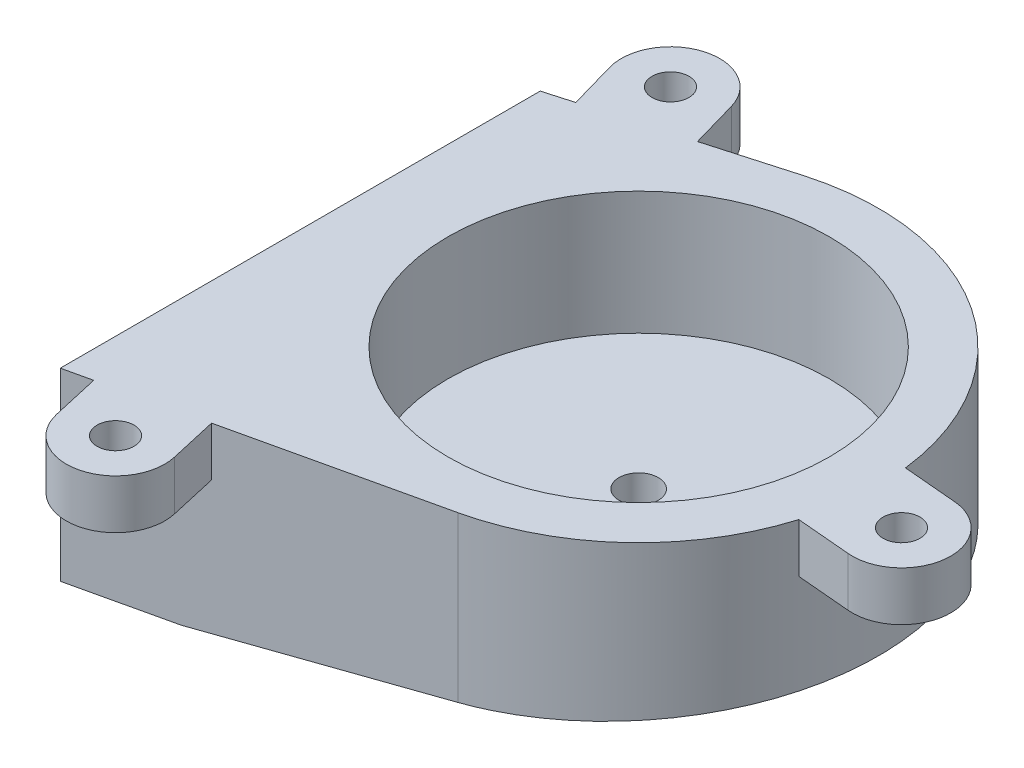
ISO-10303-21;
HEADER;
FILE_DESCRIPTION(('STEP AP214'),'2;1');
FILE_NAME('part.step','',(''),(''),'','','');
FILE_SCHEMA(('AUTOMOTIVE_DESIGN { 1 0 10303 214 1 1 1 1 }'));
ENDSEC;
DATA;
#1=APPLICATION_CONTEXT('core data for automotive mechanical design processes');
#2=APPLICATION_PROTOCOL_DEFINITION('international standard','automotive_design',2000,#1);
#3=PRODUCT_CONTEXT('',#1,'mechanical');
#4=PRODUCT('Part','Part','',(#3));
#5=PRODUCT_RELATED_PRODUCT_CATEGORY('part','',(#4));
#6=PRODUCT_DEFINITION_FORMATION('','',#4);
#7=PRODUCT_DEFINITION_CONTEXT('part definition',#1,'design');
#8=PRODUCT_DEFINITION('design','',#6,#7);
#9=PRODUCT_DEFINITION_SHAPE('','',#8);
#10=(LENGTH_UNIT() NAMED_UNIT(*) SI_UNIT(.MILLI.,.METRE.));
#11=(NAMED_UNIT(*) PLANE_ANGLE_UNIT() SI_UNIT($,.RADIAN.));
#12=(NAMED_UNIT(*) SI_UNIT($,.STERADIAN.) SOLID_ANGLE_UNIT());
#13=UNCERTAINTY_MEASURE_WITH_UNIT(LENGTH_MEASURE(1.E-05),#10,'distance_accuracy_value','');
#14=(GEOMETRIC_REPRESENTATION_CONTEXT(3) GLOBAL_UNCERTAINTY_ASSIGNED_CONTEXT((#13)) GLOBAL_UNIT_ASSIGNED_CONTEXT((#10,
#11,#12)) REPRESENTATION_CONTEXT('',''));
#15=CARTESIAN_POINT('',(0.,0.,0.));
#16=DIRECTION('',(0.,0.,1.));
#17=DIRECTION('',(1.,0.,0.));
#18=AXIS2_PLACEMENT_3D('',#15,#16,#17);
#19=CARTESIAN_POINT('',(4.32348319389158,15.,19.0146652106246));
#20=DIRECTION('',(0.221717086866235,0.,0.975111036442287));
#21=DIRECTION('',(0.975111036442287,0.,-0.221717086866235));
#22=AXIS2_PLACEMENT_3D('',#19,#20,#21);
#23=PLANE('',#22);
#24=DIRECTION('',(0.975111036442287,0.,-0.221717086866235));
#25=VECTOR('',#24,1.);
#26=CARTESIAN_POINT('',(4.32348319389158,11.,19.0146652106246));
#27=LINE('',#26,#25);
#28=CARTESIAN_POINT('',(-19.7873124932341,11.,24.4968874212158));
#29=VERTEX_POINT('',#28);
#30=CARTESIAN_POINT('',(-11.9864242016958,11.,22.7231507262859));
#31=VERTEX_POINT('',#30);
#32=EDGE_CURVE('E210',#29,#31,#27,.T.);
#33=ORIENTED_EDGE('',*,*,#32,.F.);
#34=DIRECTION('',(0.,1.,0.));
#35=VECTOR('',#34,1.);
#36=CARTESIAN_POINT('',(-19.7873124932341,11.,24.4968874212158));
#37=LINE('',#36,#35);
#38=CARTESIAN_POINT('',(-19.7873124932341,15.,24.4968874212158));
#39=VERTEX_POINT('',#38);
#40=EDGE_CURVE('E224',#29,#39,#37,.T.);
#41=ORIENTED_EDGE('',*,*,#40,.T.);
#42=DIRECTION('',(-0.975111036442287,0.,0.221717086866235));
#43=VECTOR('',#42,1.);
#44=CARTESIAN_POINT('',(4.32348319389158,15.,19.0146652106246));
#45=LINE('',#44,#43);
#46=CARTESIAN_POINT('',(-22.,15.,25.));
#47=VERTEX_POINT('',#46);
#48=EDGE_CURVE('E308',#39,#47,#45,.T.);
#49=ORIENTED_EDGE('',*,*,#48,.T.);
#50=DIRECTION('',(0.,-1.,0.));
#51=VECTOR('',#50,1.);
#52=CARTESIAN_POINT('',(-22.,15.,25.));
#53=LINE('',#52,#51);
#54=CARTESIAN_POINT('',(-22.,0.,25.));
#55=VERTEX_POINT('',#54);
#56=EDGE_CURVE('E323',#47,#55,#53,.T.);
#57=ORIENTED_EDGE('',*,*,#56,.T.);
#58=DIRECTION('',(-0.975111036442287,0.,0.221717086866235));
#59=VECTOR('',#58,1.);
#60=CARTESIAN_POINT('',(4.32348319389158,0.,19.0146652106246));
#61=LINE('',#60,#59);
#62=CARTESIAN_POINT('',(-14.,0.,23.1809900322722));
#63=VERTEX_POINT('',#62);
#64=EDGE_CURVE('E317',#63,#55,#61,.T.);
#65=ORIENTED_EDGE('',*,*,#64,.F.);
#66=DIRECTION('',(0.971414372160437,0.0869923318352629,-0.220876553219231));
#67=VECTOR('',#66,1.);
#68=CARTESIAN_POINT('',(5.4524012180103,1.7420060792248,18.7579760682972));
#69=LINE('',#68,#67);
#70=CARTESIAN_POINT('',(4.32348319389158,1.64090894273656,19.0146652106246));
#71=VERTEX_POINT('',#70);
#72=EDGE_CURVE('E291',#63,#71,#69,.T.);
#73=ORIENTED_EDGE('',*,*,#72,.T.);
#74=DIRECTION('',(0.,-1.,0.));
#75=VECTOR('',#74,1.);
#76=CARTESIAN_POINT('',(4.32348319389158,15.,19.0146652106246));
#77=LINE('',#76,#75);
#78=CARTESIAN_POINT('',(4.32348319389158,15.,19.0146652106246));
#79=VERTEX_POINT('',#78);
#80=EDGE_CURVE('E326',#79,#71,#77,.T.);
#81=ORIENTED_EDGE('',*,*,#80,.F.);
#82=CARTESIAN_POINT('',(-11.9864242016958,15.,22.7231507262859));
#83=VERTEX_POINT('',#82);
#84=EDGE_CURVE('E309',#79,#83,#45,.T.);
#85=ORIENTED_EDGE('',*,*,#84,.T.);
#86=DIRECTION('',(0.,1.,0.));
#87=VECTOR('',#86,1.);
#88=CARTESIAN_POINT('',(-11.9864242016958,11.,22.7231507262859));
#89=LINE('',#88,#87);
#90=EDGE_CURVE('E228',#31,#83,#89,.T.);
#91=ORIENTED_EDGE('',*,*,#90,.F.);
#92=EDGE_LOOP('',(#33,#41,#49,#57,#65,#73,#81,#85,#91));
#93=FACE_BOUND('',#92,.T.);
#94=ADVANCED_FACE('F37',(#93),#23,.T.);
#95=CARTESIAN_POINT('',(-5.35142928494359,15.,-18.7513254093743));
#96=DIRECTION('',(-0.274432271022749,0.,-0.961606431249967));
#97=DIRECTION('',(-0.961606431249967,0.,0.274432271022749));
#98=AXIS2_PLACEMENT_3D('',#95,#96,#97);
#99=PLANE('',#98);
#100=DIRECTION('',(-0.961606431249967,0.,0.274432271022748));
#101=VECTOR('',#100,1.);
#102=CARTESIAN_POINT('',(-5.35142928494359,11.,-18.7513254093743));
#103=LINE('',#102,#101);
#104=CARTESIAN_POINT('',(-12.0558451909091,11.,-16.8379562562963));
#105=VERTEX_POINT('',#104);
#106=CARTESIAN_POINT('',(-19.7486966409089,11.,-14.6424980881143));
#107=VERTEX_POINT('',#106);
#108=EDGE_CURVE('E247',#105,#107,#103,.T.);
#109=ORIENTED_EDGE('',*,*,#108,.F.);
#110=DIRECTION('',(0.,1.,0.));
#111=VECTOR('',#110,1.);
#112=CARTESIAN_POINT('',(-12.0558451909091,11.,-16.8379562562963));
#113=LINE('',#112,#111);
#114=CARTESIAN_POINT('',(-12.0558451909091,15.,-16.8379562562963));
#115=VERTEX_POINT('',#114);
#116=EDGE_CURVE('E261',#105,#115,#113,.T.);
#117=ORIENTED_EDGE('',*,*,#116,.T.);
#118=DIRECTION('',(0.961606431249967,0.,-0.274432271022748));
#119=VECTOR('',#118,1.);
#120=CARTESIAN_POINT('',(-5.35142928494359,15.,-18.7513254093743));
#121=LINE('',#120,#119);
#122=CARTESIAN_POINT('',(-5.3514292849436,15.,-18.7513254093743));
#123=VERTEX_POINT('',#122);
#124=EDGE_CURVE('E301',#115,#123,#121,.T.);
#125=ORIENTED_EDGE('',*,*,#124,.T.);
#126=DIRECTION('',(0.,-1.,0.));
#127=VECTOR('',#126,1.);
#128=CARTESIAN_POINT('',(-5.3514292849436,15.,-18.7513254093743));
#129=LINE('',#128,#127);
#130=CARTESIAN_POINT('',(-5.3514292849436,0.774498870005051,-18.7513254093743));
#131=VERTEX_POINT('',#130);
#132=EDGE_CURVE('E314',#123,#131,#129,.T.);
#133=ORIENTED_EDGE('',*,*,#132,.T.);
#134=DIRECTION('',(-0.958060684401584,-0.0857964792001418,0.273420352499275));
#135=VECTOR('',#134,1.);
#136=CARTESIAN_POINT('',(-4.18211822024305,0.879213293709578,-19.0850343786464));
#137=LINE('',#136,#135);
#138=CARTESIAN_POINT('',(-14.,0.,-16.2831151049272));
#139=VERTEX_POINT('',#138);
#140=EDGE_CURVE('E294',#131,#139,#137,.T.);
#141=ORIENTED_EDGE('',*,*,#140,.T.);
#142=DIRECTION('',(0.961606431249967,0.,-0.274432271022748));
#143=VECTOR('',#142,1.);
#144=CARTESIAN_POINT('',(-5.35142928494359,0.,-18.7513254093743));
#145=LINE('',#144,#143);
#146=CARTESIAN_POINT('',(-22.,0.,-14.));
#147=VERTEX_POINT('',#146);
#148=EDGE_CURVE('E297',#147,#139,#145,.T.);
#149=ORIENTED_EDGE('',*,*,#148,.F.);
#150=DIRECTION('',(0.,-1.,0.));
#151=VECTOR('',#150,1.);
#152=CARTESIAN_POINT('',(-22.,15.,-14.));
#153=LINE('',#152,#151);
#154=CARTESIAN_POINT('',(-22.,15.,-14.));
#155=VERTEX_POINT('',#154);
#156=EDGE_CURVE('E321',#155,#147,#153,.T.);
#157=ORIENTED_EDGE('',*,*,#156,.F.);
#158=CARTESIAN_POINT('',(-19.7486966409089,15.,-14.6424980881143));
#159=VERTEX_POINT('',#158);
#160=EDGE_CURVE('E303',#155,#159,#121,.T.);
#161=ORIENTED_EDGE('',*,*,#160,.T.);
#162=DIRECTION('',(0.,1.,0.));
#163=VECTOR('',#162,1.);
#164=CARTESIAN_POINT('',(-19.7486966409089,11.,-14.6424980881143));
#165=LINE('',#164,#163);
#166=EDGE_CURVE('E265',#107,#159,#165,.T.);
#167=ORIENTED_EDGE('',*,*,#166,.F.);
#168=EDGE_LOOP('',(#109,#117,#125,#133,#141,#149,#157,#161,#167));
#169=FACE_BOUND('',#168,.T.);
#170=ADVANCED_FACE('F370',(#169),#99,.T.);
#171=CARTESIAN_POINT('',(0.,15.,0.));
#172=DIRECTION('',(0.,-1.,0.));
#173=DIRECTION('',(0.,0.,-1.));
#174=AXIS2_PLACEMENT_3D('',#171,#172,#173);
#175=CYLINDRICAL_SURFACE('',#174,19.5);
#176=DIRECTION('',(0.,1.,0.));
#177=VECTOR('',#176,1.);
#178=CARTESIAN_POINT('',(18.664086252509,11.,5.64817531233798));
#179=LINE('',#178,#177);
#180=CARTESIAN_POINT('',(18.664086252509,11.,5.64817531233798));
#181=VERTEX_POINT('',#180);
#182=CARTESIAN_POINT('',(18.664086252509,15.,5.64817531233798));
#183=VERTEX_POINT('',#182);
#184=EDGE_CURVE('E177',#181,#183,#179,.T.);
#185=ORIENTED_EDGE('',*,*,#184,.T.);
#186=CARTESIAN_POINT('',(0.,15.,0.));
#187=DIRECTION('',(0.,-1.,0.));
#188=DIRECTION('',(0.,0.,-1.));
#189=AXIS2_PLACEMENT_3D('',#186,#187,#188);
#190=CIRCLE('',#189,19.5);
#191=EDGE_CURVE('E305',#183,#79,#190,.T.);
#192=ORIENTED_EDGE('',*,*,#191,.T.);
#193=ORIENTED_EDGE('',*,*,#80,.T.);
#194=CARTESIAN_POINT('',(0.,1.25373134328358,0.));
#195=DIRECTION('',(0.0891952975496599,-0.996014155971203,0.));
#196=DIRECTION('',(-0.996014155971203,-0.0891952975496599,0.));
#197=AXIS2_PLACEMENT_3D('',#194,#195,#196);
#198=ELLIPSE('',#197,19.5780349938759,19.5);
#199=EDGE_CURVE('E288',#71,#131,#198,.F.);
#200=ORIENTED_EDGE('',*,*,#199,.T.);
#201=ORIENTED_EDGE('',*,*,#132,.F.);
#202=CARTESIAN_POINT('',(19.3613321944903,15.,-2.32138227239599));
#203=VERTEX_POINT('',#202);
#204=EDGE_CURVE('E306',#123,#203,#190,.T.);
#205=ORIENTED_EDGE('',*,*,#204,.T.);
#206=DIRECTION('',(0.,1.,0.));
#207=VECTOR('',#206,1.);
#208=CARTESIAN_POINT('',(19.3613321944903,11.,-2.32138227239599));
#209=LINE('',#208,#207);
#210=CARTESIAN_POINT('',(19.3613321944903,11.,-2.32138227239599));
#211=VERTEX_POINT('',#210);
#212=EDGE_CURVE('E57',#211,#203,#209,.T.);
#213=ORIENTED_EDGE('',*,*,#212,.F.);
#214=CARTESIAN_POINT('',(0.,11.,0.));
#215=DIRECTION('',(0.,1.,0.));
#216=DIRECTION('',(0.,0.,1.));
#217=AXIS2_PLACEMENT_3D('',#214,#215,#216);
#218=CIRCLE('',#217,19.5);
#219=EDGE_CURVE('E52',#181,#211,#218,.T.);
#220=ORIENTED_EDGE('',*,*,#219,.F.);
#221=EDGE_LOOP('',(#185,#192,#193,#200,#201,#205,#213,#220));
#222=FACE_BOUND('',#221,.T.);
#223=ADVANCED_FACE('F376',(#222),#175,.T.);
#224=CARTESIAN_POINT('',(0.,0.,0.));
#225=DIRECTION('',(0.,1.,0.));
#226=DIRECTION('',(0.,0.,1.));
#227=AXIS2_PLACEMENT_3D('',#224,#225,#226);
#228=PLANE('',#227);
#229=CARTESIAN_POINT('',(-18.,0.,5.5));
#230=DIRECTION('',(0.,-1.,0.));
#231=DIRECTION('',(0.,0.,-1.));
#232=AXIS2_PLACEMENT_3D('',#229,#230,#231);
#233=CIRCLE('',#232,2.05);
#234=CARTESIAN_POINT('',(-18.,0.,3.45));
#235=VERTEX_POINT('',#234);
#236=EDGE_CURVE('E277',#235,#235,#233,.T.);
#237=ORIENTED_EDGE('',*,*,#236,.F.);
#238=EDGE_LOOP('',(#237));
#239=FACE_BOUND('',#238,.T.);
#240=DIRECTION('',(0.,0.,-1.));
#241=VECTOR('',#240,1.);
#242=CARTESIAN_POINT('',(-14.,0.,0.));
#243=LINE('',#242,#241);
#244=EDGE_CURVE('E11',#63,#139,#243,.T.);
#245=ORIENTED_EDGE('',*,*,#244,.F.);
#246=ORIENTED_EDGE('',*,*,#64,.T.);
#247=DIRECTION('',(0.,0.,-1.));
#248=VECTOR('',#247,1.);
#249=CARTESIAN_POINT('',(-22.,0.,0.));
#250=LINE('',#249,#248);
#251=EDGE_CURVE('E302',#55,#147,#250,.T.);
#252=ORIENTED_EDGE('',*,*,#251,.T.);
#253=ORIENTED_EDGE('',*,*,#148,.T.);
#254=EDGE_LOOP('',(#245,#246,#252,#253));
#255=FACE_BOUND('',#254,.T.);
#256=ADVANCED_FACE('F39',(#239,#255),#228,.F.);
#257=CARTESIAN_POINT('',(0.,5.,0.));
#258=DIRECTION('',(0.,1.,0.));
#259=DIRECTION('',(0.,0.,1.));
#260=AXIS2_PLACEMENT_3D('',#257,#258,#259);
#261=PLANE('',#260);
#262=CARTESIAN_POINT('',(0.,5.,0.));
#263=DIRECTION('',(0.,1.,0.));
#264=DIRECTION('',(0.,0.,1.));
#265=AXIS2_PLACEMENT_3D('',#262,#263,#264);
#266=CIRCLE('',#265,1.6);
#267=CARTESIAN_POINT('',(0.,5.,1.6));
#268=VERTEX_POINT('',#267);
#269=EDGE_CURVE('E283',#268,#268,#266,.T.);
#270=ORIENTED_EDGE('',*,*,#269,.F.);
#271=EDGE_LOOP('',(#270));
#272=FACE_BOUND('',#271,.T.);
#273=CARTESIAN_POINT('',(0.,5.,0.));
#274=DIRECTION('',(0.,1.,0.));
#275=DIRECTION('',(0.,0.,1.));
#276=AXIS2_PLACEMENT_3D('',#273,#274,#275);
#277=CIRCLE('',#276,15.5);
#278=CARTESIAN_POINT('',(0.,5.,15.5));
#279=VERTEX_POINT('',#278);
#280=EDGE_CURVE('E45',#279,#279,#277,.T.);
#281=ORIENTED_EDGE('',*,*,#280,.T.);
#282=EDGE_LOOP('',(#281));
#283=FACE_BOUND('',#282,.T.);
#284=ADVANCED_FACE('F333',(#272,#283),#261,.T.);
#285=CARTESIAN_POINT('',(-22.,15.,0.));
#286=DIRECTION('',(-1.,0.,0.));
#287=DIRECTION('',(0.,0.,1.));
#288=AXIS2_PLACEMENT_3D('',#285,#286,#287);
#289=PLANE('',#288);
#290=ORIENTED_EDGE('',*,*,#251,.F.);
#291=ORIENTED_EDGE('',*,*,#56,.F.);
#292=DIRECTION('',(0.,0.,-1.));
#293=VECTOR('',#292,1.);
#294=CARTESIAN_POINT('',(-22.,15.,0.));
#295=LINE('',#294,#293);
#296=EDGE_CURVE('E311',#47,#155,#295,.T.);
#297=ORIENTED_EDGE('',*,*,#296,.T.);
#298=ORIENTED_EDGE('',*,*,#156,.T.);
#299=EDGE_LOOP('',(#290,#291,#297,#298));
#300=FACE_BOUND('',#299,.T.);
#301=ADVANCED_FACE('F339',(#300),#289,.T.);
#302=CARTESIAN_POINT('',(0.,15.,0.));
#303=DIRECTION('',(0.,-1.,0.));
#304=DIRECTION('',(0.,0.,-1.));
#305=AXIS2_PLACEMENT_3D('',#302,#303,#304);
#306=CYLINDRICAL_SURFACE('',#305,15.5);
#307=ORIENTED_EDGE('',*,*,#280,.F.);
#308=EDGE_LOOP('',(#307));
#309=FACE_BOUND('',#308,.T.);
#310=CARTESIAN_POINT('',(0.,15.,0.));
#311=DIRECTION('',(0.,-1.,0.));
#312=DIRECTION('',(0.,0.,-1.));
#313=AXIS2_PLACEMENT_3D('',#310,#311,#312);
#314=CIRCLE('',#313,15.5);
#315=CARTESIAN_POINT('',(0.,15.,-15.5));
#316=VERTEX_POINT('',#315);
#317=EDGE_CURVE('E298',#316,#316,#314,.T.);
#318=ORIENTED_EDGE('',*,*,#317,.F.);
#319=EDGE_LOOP('',(#318));
#320=FACE_BOUND('',#319,.T.);
#321=ADVANCED_FACE('F335',(#309,#320),#306,.F.);
#322=CARTESIAN_POINT('',(0.,15.,0.));
#323=DIRECTION('',(0.,-1.,0.));
#324=DIRECTION('',(0.,0.,-1.));
#325=AXIS2_PLACEMENT_3D('',#322,#323,#324);
#326=PLANE('',#325);
#327=ORIENTED_EDGE('',*,*,#317,.T.);
#328=EDGE_LOOP('',(#327));
#329=FACE_BOUND('',#328,.T.);
#330=ORIENTED_EDGE('',*,*,#160,.F.);
#331=ORIENTED_EDGE('',*,*,#296,.F.);
#332=ORIENTED_EDGE('',*,*,#48,.F.);
#333=DIRECTION('',(-0.221717086866236,0.,-0.975111036442286));
#334=VECTOR('',#333,1.);
#335=CARTESIAN_POINT('',(-24.1107956871257,15.,5.48222221059121));
#336=LINE('',#335,#334);
#337=CARTESIAN_POINT('',(-18.9004441457691,15.,28.3973315669849));
#338=VERTEX_POINT('',#337);
#339=EDGE_CURVE('E216',#338,#39,#336,.T.);
#340=ORIENTED_EDGE('',*,*,#339,.F.);
#341=CARTESIAN_POINT('',(-15.,15.,27.51046321952));
#342=DIRECTION('',(0.,1.,0.));
#343=DIRECTION('',(0.,0.,1.));
#344=AXIS2_PLACEMENT_3D('',#341,#342,#343);
#345=CIRCLE('',#344,4.);
#346=CARTESIAN_POINT('',(-11.0995558542309,15.,26.623594872055));
#347=VERTEX_POINT('',#346);
#348=EDGE_CURVE('E219',#338,#347,#345,.T.);
#349=ORIENTED_EDGE('',*,*,#348,.T.);
#350=DIRECTION('',(-0.221717086866235,0.,-0.975111036442287));
#351=VECTOR('',#350,1.);
#352=CARTESIAN_POINT('',(-16.3099073955874,15.,3.7084855156613));
#353=LINE('',#352,#351);
#354=EDGE_CURVE('E201',#347,#83,#353,.T.);
#355=ORIENTED_EDGE('',*,*,#354,.T.);
#356=ORIENTED_EDGE('',*,*,#84,.F.);
#357=ORIENTED_EDGE('',*,*,#191,.F.);
#358=DIRECTION('',(0.996194698091746,0.,0.0871557427476584));
#359=VECTOR('',#358,1.);
#360=CARTESIAN_POINT('',(-0.348622970990634,15.,3.98477879236698));
#361=LINE('',#360,#359);
#362=CARTESIAN_POINT('',(23.0619524341654,15.,6.03293874693695));
#363=VERTEX_POINT('',#362);
#364=EDGE_CURVE('E188',#183,#363,#361,.T.);
#365=ORIENTED_EDGE('',*,*,#364,.T.);
#366=CARTESIAN_POINT('',(23.410575405156,15.,2.04815995456997));
#367=DIRECTION('',(0.,1.,0.));
#368=DIRECTION('',(0.,0.,1.));
#369=AXIS2_PLACEMENT_3D('',#366,#367,#368);
#370=CIRCLE('',#369,3.99999999999999);
#371=CARTESIAN_POINT('',(23.7591983761467,15.,-1.93661883779701));
#372=VERTEX_POINT('',#371);
#373=EDGE_CURVE('E159',#363,#372,#370,.T.);
#374=ORIENTED_EDGE('',*,*,#373,.T.);
#375=DIRECTION('',(0.996194698091746,0.,0.0871557427476586));
#376=VECTOR('',#375,1.);
#377=CARTESIAN_POINT('',(0.348622970990635,15.,-3.98477879236699));
#378=LINE('',#377,#376);
#379=EDGE_CURVE('E181',#203,#372,#378,.T.);
#380=ORIENTED_EDGE('',*,*,#379,.F.);
#381=ORIENTED_EDGE('',*,*,#204,.F.);
#382=ORIENTED_EDGE('',*,*,#124,.F.);
#383=DIRECTION('',(0.274432271022749,0.,0.961606431249967));
#384=VECTOR('',#383,1.);
#385=CARTESIAN_POINT('',(-6.70441590596554,15.,1.91336915307806));
#386=LINE('',#385,#384);
#387=CARTESIAN_POINT('',(-13.1535742750001,15.,-20.6843819812962));
#388=VERTEX_POINT('',#387);
#389=EDGE_CURVE('E253',#388,#115,#386,.T.);
#390=ORIENTED_EDGE('',*,*,#389,.F.);
#391=CARTESIAN_POINT('',(-17.,15.,-19.5866528972052));
#392=DIRECTION('',(0.,1.,0.));
#393=DIRECTION('',(0.,0.,1.));
#394=AXIS2_PLACEMENT_3D('',#391,#392,#393);
#395=CIRCLE('',#394,4.);
#396=CARTESIAN_POINT('',(-20.8464257249999,15.,-18.4889238131142));
#397=VERTEX_POINT('',#396);
#398=EDGE_CURVE('E256',#388,#397,#395,.T.);
#399=ORIENTED_EDGE('',*,*,#398,.T.);
#400=DIRECTION('',(0.274432271022748,0.,0.961606431249967));
#401=VECTOR('',#400,1.);
#402=CARTESIAN_POINT('',(-14.3972673559653,15.,4.10882732126004));
#403=LINE('',#402,#401);
#404=EDGE_CURVE('E238',#397,#159,#403,.T.);
#405=ORIENTED_EDGE('',*,*,#404,.T.);
#406=EDGE_LOOP('',(#330,#331,#332,#340,#349,#355,#356,#357,#365,#374,#380,#381,#382,#390,#399,#405));
#407=FACE_BOUND('',#406,.T.);
#408=CARTESIAN_POINT('',(-17.,15.,-19.5866528972052));
#409=DIRECTION('',(0.,1.,0.));
#410=DIRECTION('',(0.,0.,1.));
#411=AXIS2_PLACEMENT_3D('',#408,#409,#410);
#412=CIRCLE('',#411,1.5);
#413=CARTESIAN_POINT('',(-17.,15.,-18.0866528972052));
#414=VERTEX_POINT('',#413);
#415=EDGE_CURVE('E227',#414,#414,#412,.T.);
#416=ORIENTED_EDGE('',*,*,#415,.F.);
#417=EDGE_LOOP('',(#416));
#418=FACE_BOUND('',#417,.T.);
#419=CARTESIAN_POINT('',(-15.,15.,27.51046321952));
#420=DIRECTION('',(0.,1.,0.));
#421=DIRECTION('',(0.,0.,1.));
#422=AXIS2_PLACEMENT_3D('',#419,#420,#421);
#423=CIRCLE('',#422,1.5);
#424=CARTESIAN_POINT('',(-15.,15.,29.01046321952));
#425=VERTEX_POINT('',#424);
#426=EDGE_CURVE('E194',#425,#425,#423,.T.);
#427=ORIENTED_EDGE('',*,*,#426,.F.);
#428=EDGE_LOOP('',(#427));
#429=FACE_BOUND('',#428,.T.);
#430=CARTESIAN_POINT('',(23.410575405156,15.,2.04815995456997));
#431=DIRECTION('',(0.,1.,0.));
#432=DIRECTION('',(0.,0.,1.));
#433=AXIS2_PLACEMENT_3D('',#430,#431,#432);
#434=CIRCLE('',#433,1.5);
#435=CARTESIAN_POINT('',(23.410575405156,15.,3.54815995456997));
#436=VERTEX_POINT('',#435);
#437=EDGE_CURVE('E178',#436,#436,#434,.T.);
#438=ORIENTED_EDGE('',*,*,#437,.F.);
#439=EDGE_LOOP('',(#438));
#440=FACE_BOUND('',#439,.T.);
#441=ADVANCED_FACE('F338',(#329,#407,#418,#429,#440),#326,.F.);
#442=CARTESIAN_POINT('',(-0.111381215469613,1.24375690607735,-23.5866528972052));
#443=DIRECTION('',(0.0891952975496599,-0.996014155971203,0.));
#444=DIRECTION('',(0.996014155971203,0.0891952975496599,0.));
#445=AXIS2_PLACEMENT_3D('',#442,#443,#444);
#446=PLANE('',#445);
#447=CARTESIAN_POINT('',(0.,1.25373134328358,0.));
#448=DIRECTION('',(0.0891952975496599,-0.996014155971203,0.));
#449=DIRECTION('',(0.996014155971203,0.0891952975496599,0.));
#450=AXIS2_PLACEMENT_3D('',#447,#448,#449);
#451=ELLIPSE('',#450,4.01600717823096,4.);
#452=CARTESIAN_POINT('',(4.,1.61194029850746,0.));
#453=VERTEX_POINT('',#452);
#454=EDGE_CURVE('E264',#453,#453,#451,.F.);
#455=ORIENTED_EDGE('',*,*,#454,.T.);
#456=EDGE_LOOP('',(#455));
#457=FACE_BOUND('',#456,.T.);
#458=ORIENTED_EDGE('',*,*,#199,.F.);
#459=ORIENTED_EDGE('',*,*,#72,.F.);
#460=ORIENTED_EDGE('',*,*,#244,.T.);
#461=ORIENTED_EDGE('',*,*,#140,.F.);
#462=EDGE_LOOP('',(#458,#459,#460,#461));
#463=FACE_BOUND('',#462,.T.);
#464=ADVANCED_FACE('F345',(#457,#463),#446,.T.);
#465=CARTESIAN_POINT('',(0.,0.,0.));
#466=DIRECTION('',(0.,1.,0.));
#467=DIRECTION('',(0.,0.,1.));
#468=AXIS2_PLACEMENT_3D('',#465,#466,#467);
#469=CYLINDRICAL_SURFACE('',#468,1.6);
#470=CARTESIAN_POINT('',(0.,2.,0.));
#471=DIRECTION('',(0.,1.,0.));
#472=DIRECTION('',(0.,0.,1.));
#473=AXIS2_PLACEMENT_3D('',#470,#471,#472);
#474=CIRCLE('',#473,1.6);
#475=CARTESIAN_POINT('',(0.,2.,1.6));
#476=VERTEX_POINT('',#475);
#477=EDGE_CURVE('E274',#476,#476,#474,.T.);
#478=ORIENTED_EDGE('',*,*,#477,.F.);
#479=EDGE_LOOP('',(#478));
#480=FACE_BOUND('',#479,.T.);
#481=ORIENTED_EDGE('',*,*,#269,.T.);
#482=EDGE_LOOP('',(#481));
#483=FACE_BOUND('',#482,.T.);
#484=ADVANCED_FACE('F392',(#480,#483),#469,.F.);
#485=CARTESIAN_POINT('',(-18.,6.,5.5));
#486=DIRECTION('',(0.,-1.,0.));
#487=DIRECTION('',(0.,0.,-1.));
#488=AXIS2_PLACEMENT_3D('',#485,#486,#487);
#489=CYLINDRICAL_SURFACE('',#488,2.05);
#490=CARTESIAN_POINT('',(-18.,6.,5.5));
#491=DIRECTION('',(0.,-1.,0.));
#492=DIRECTION('',(0.,0.,-1.));
#493=AXIS2_PLACEMENT_3D('',#490,#491,#492);
#494=CIRCLE('',#493,2.05);
#495=CARTESIAN_POINT('',(-18.,6.,3.45));
#496=VERTEX_POINT('',#495);
#497=EDGE_CURVE('E280',#496,#496,#494,.T.);
#498=ORIENTED_EDGE('',*,*,#497,.F.);
#499=EDGE_LOOP('',(#498));
#500=FACE_BOUND('',#499,.T.);
#501=ORIENTED_EDGE('',*,*,#236,.T.);
#502=EDGE_LOOP('',(#501));
#503=FACE_BOUND('',#502,.T.);
#504=ADVANCED_FACE('F394',(#500,#503),#489,.F.);
#505=CARTESIAN_POINT('',(-18.,6.,5.5));
#506=DIRECTION('',(0.,-1.,0.));
#507=DIRECTION('',(0.,0.,-1.));
#508=AXIS2_PLACEMENT_3D('',#505,#506,#507);
#509=PLANE('',#508);
#510=ORIENTED_EDGE('',*,*,#497,.T.);
#511=EDGE_LOOP('',(#510));
#512=FACE_BOUND('',#511,.T.);
#513=ADVANCED_FACE('F401',(#512),#509,.T.);
#514=CARTESIAN_POINT('',(0.,-0.00100000000000013,0.));
#515=DIRECTION('',(0.,1.,0.));
#516=DIRECTION('',(0.,0.,1.));
#517=AXIS2_PLACEMENT_3D('',#514,#515,#516);
#518=CYLINDRICAL_SURFACE('',#517,4.);
#519=ORIENTED_EDGE('',*,*,#454,.F.);
#520=EDGE_LOOP('',(#519));
#521=FACE_BOUND('',#520,.T.);
#522=CARTESIAN_POINT('',(0.,2.,0.));
#523=DIRECTION('',(0.,1.,0.));
#524=DIRECTION('',(0.,0.,1.));
#525=AXIS2_PLACEMENT_3D('',#522,#523,#524);
#526=CIRCLE('',#525,4.);
#527=CARTESIAN_POINT('',(0.,2.,4.));
#528=VERTEX_POINT('',#527);
#529=EDGE_CURVE('E271',#528,#528,#526,.T.);
#530=ORIENTED_EDGE('',*,*,#529,.T.);
#531=EDGE_LOOP('',(#530));
#532=FACE_BOUND('',#531,.T.);
#533=ADVANCED_FACE('F410',(#521,#532),#518,.F.);
#534=CARTESIAN_POINT('',(0.,2.,0.));
#535=DIRECTION('',(0.,1.,0.));
#536=DIRECTION('',(0.,0.,1.));
#537=AXIS2_PLACEMENT_3D('',#534,#535,#536);
#538=PLANE('',#537);
#539=ORIENTED_EDGE('',*,*,#477,.T.);
#540=EDGE_LOOP('',(#539));
#541=FACE_BOUND('',#540,.T.);
#542=ORIENTED_EDGE('',*,*,#529,.F.);
#543=EDGE_LOOP('',(#542));
#544=FACE_BOUND('',#543,.T.);
#545=ADVANCED_FACE('F414',(#541,#544),#538,.F.);
#546=CARTESIAN_POINT('',(-6.70441590596554,11.,1.91336915307806));
#547=DIRECTION('',(-0.961606431249967,0.,0.274432271022749));
#548=DIRECTION('',(0.274432271022749,0.,0.961606431249967));
#549=AXIS2_PLACEMENT_3D('',#546,#547,#548);
#550=PLANE('',#549);
#551=ORIENTED_EDGE('',*,*,#389,.T.);
#552=ORIENTED_EDGE('',*,*,#116,.F.);
#553=DIRECTION('',(0.274432271022749,0.,0.961606431249967));
#554=VECTOR('',#553,1.);
#555=CARTESIAN_POINT('',(-6.70441590596554,11.,1.91336915307806));
#556=LINE('',#555,#554);
#557=CARTESIAN_POINT('',(-13.1535742750001,11.,-20.6843819812962));
#558=VERTEX_POINT('',#557);
#559=EDGE_CURVE('E237',#558,#105,#556,.T.);
#560=ORIENTED_EDGE('',*,*,#559,.F.);
#561=DIRECTION('',(0.,1.,0.));
#562=VECTOR('',#561,1.);
#563=CARTESIAN_POINT('',(-13.1535742750001,11.,-20.6843819812962));
#564=LINE('',#563,#562);
#565=EDGE_CURVE('E250',#558,#388,#564,.T.);
#566=ORIENTED_EDGE('',*,*,#565,.T.);
#567=EDGE_LOOP('',(#551,#552,#560,#566));
#568=FACE_BOUND('',#567,.T.);
#569=ADVANCED_FACE('F418',(#568),#550,.F.);
#570=CARTESIAN_POINT('',(-14.3972673559653,11.,4.10882732126004));
#571=DIRECTION('',(-0.961606431249967,0.,0.274432271022748));
#572=DIRECTION('',(0.274432271022748,0.,0.961606431249967));
#573=AXIS2_PLACEMENT_3D('',#570,#571,#572);
#574=PLANE('',#573);
#575=ORIENTED_EDGE('',*,*,#404,.F.);
#576=DIRECTION('',(0.,1.,0.));
#577=VECTOR('',#576,1.);
#578=CARTESIAN_POINT('',(-20.8464257249999,11.,-18.4889238131142));
#579=LINE('',#578,#577);
#580=CARTESIAN_POINT('',(-20.8464257249999,11.,-18.4889238131142));
#581=VERTEX_POINT('',#580);
#582=EDGE_CURVE('E268',#581,#397,#579,.T.);
#583=ORIENTED_EDGE('',*,*,#582,.F.);
#584=DIRECTION('',(0.274432271022748,0.,0.961606431249967));
#585=VECTOR('',#584,1.);
#586=CARTESIAN_POINT('',(-14.3972673559653,11.,4.10882732126004));
#587=LINE('',#586,#585);
#588=EDGE_CURVE('E244',#581,#107,#587,.T.);
#589=ORIENTED_EDGE('',*,*,#588,.T.);
#590=ORIENTED_EDGE('',*,*,#166,.T.);
#591=EDGE_LOOP('',(#575,#583,#589,#590));
#592=FACE_BOUND('',#591,.T.);
#593=ADVANCED_FACE('F424',(#592),#574,.T.);
#594=CARTESIAN_POINT('',(-17.,11.,-19.5866528972052));
#595=DIRECTION('',(0.,1.,0.));
#596=DIRECTION('',(0.,0.,1.));
#597=AXIS2_PLACEMENT_3D('',#594,#595,#596);
#598=CYLINDRICAL_SURFACE('',#597,1.5);
#599=CARTESIAN_POINT('',(-17.,11.,-19.5866528972052));
#600=DIRECTION('',(0.,1.,0.));
#601=DIRECTION('',(0.,0.,1.));
#602=AXIS2_PLACEMENT_3D('',#599,#600,#601);
#603=CIRCLE('',#602,1.5);
#604=CARTESIAN_POINT('',(-17.,11.,-18.0866528972052));
#605=VERTEX_POINT('',#604);
#606=EDGE_CURVE('E234',#605,#605,#603,.T.);
#607=ORIENTED_EDGE('',*,*,#606,.F.);
#608=EDGE_LOOP('',(#607));
#609=FACE_BOUND('',#608,.T.);
#610=ORIENTED_EDGE('',*,*,#415,.T.);
#611=EDGE_LOOP('',(#610));
#612=FACE_BOUND('',#611,.T.);
#613=ADVANCED_FACE('F420',(#609,#612),#598,.F.);
#614=CARTESIAN_POINT('',(-17.,11.,-19.5866528972052));
#615=DIRECTION('',(0.,1.,0.));
#616=DIRECTION('',(0.,0.,1.));
#617=AXIS2_PLACEMENT_3D('',#614,#615,#616);
#618=CYLINDRICAL_SURFACE('',#617,4.);
#619=ORIENTED_EDGE('',*,*,#398,.F.);
#620=ORIENTED_EDGE('',*,*,#565,.F.);
#621=CARTESIAN_POINT('',(-17.,11.,-19.5866528972052));
#622=DIRECTION('',(0.,1.,0.));
#623=DIRECTION('',(0.,0.,1.));
#624=AXIS2_PLACEMENT_3D('',#621,#622,#623);
#625=CIRCLE('',#624,4.);
#626=EDGE_CURVE('E241',#558,#581,#625,.T.);
#627=ORIENTED_EDGE('',*,*,#626,.T.);
#628=ORIENTED_EDGE('',*,*,#582,.T.);
#629=EDGE_LOOP('',(#619,#620,#627,#628));
#630=FACE_BOUND('',#629,.T.);
#631=ADVANCED_FACE('F423',(#630),#618,.T.);
#632=CARTESIAN_POINT('',(0.,11.,0.));
#633=DIRECTION('',(0.,1.,0.));
#634=DIRECTION('',(0.,0.,1.));
#635=AXIS2_PLACEMENT_3D('',#632,#633,#634);
#636=PLANE('',#635);
#637=ORIENTED_EDGE('',*,*,#606,.T.);
#638=EDGE_LOOP('',(#637));
#639=FACE_BOUND('',#638,.T.);
#640=ORIENTED_EDGE('',*,*,#559,.T.);
#641=ORIENTED_EDGE('',*,*,#108,.T.);
#642=ORIENTED_EDGE('',*,*,#588,.F.);
#643=ORIENTED_EDGE('',*,*,#626,.F.);
#644=EDGE_LOOP('',(#640,#641,#642,#643));
#645=FACE_BOUND('',#644,.T.);
#646=ADVANCED_FACE('F431',(#639,#645),#636,.F.);
#647=CARTESIAN_POINT('',(-24.1107956871257,11.,5.48222221059121));
#648=DIRECTION('',(0.975111036442286,0.,-0.221717086866236));
#649=DIRECTION('',(-0.221717086866236,0.,-0.975111036442286));
#650=AXIS2_PLACEMENT_3D('',#647,#648,#649);
#651=PLANE('',#650);
#652=ORIENTED_EDGE('',*,*,#339,.T.);
#653=ORIENTED_EDGE('',*,*,#40,.F.);
#654=DIRECTION('',(-0.221717086866236,0.,-0.975111036442286));
#655=VECTOR('',#654,1.);
#656=CARTESIAN_POINT('',(-24.1107956871257,11.,5.48222221059121));
#657=LINE('',#656,#655);
#658=CARTESIAN_POINT('',(-18.9004441457691,11.,28.3973315669849));
#659=VERTEX_POINT('',#658);
#660=EDGE_CURVE('E200',#659,#29,#657,.T.);
#661=ORIENTED_EDGE('',*,*,#660,.F.);
#662=DIRECTION('',(0.,1.,0.));
#663=VECTOR('',#662,1.);
#664=CARTESIAN_POINT('',(-18.9004441457691,11.,28.3973315669849));
#665=LINE('',#664,#663);
#666=EDGE_CURVE('E213',#659,#338,#665,.T.);
#667=ORIENTED_EDGE('',*,*,#666,.T.);
#668=EDGE_LOOP('',(#652,#653,#661,#667));
#669=FACE_BOUND('',#668,.T.);
#670=ADVANCED_FACE('F438',(#669),#651,.F.);
#671=CARTESIAN_POINT('',(-16.3099073955874,11.,3.7084855156613));
#672=DIRECTION('',(0.975111036442287,0.,-0.221717086866235));
#673=DIRECTION('',(-0.221717086866235,0.,-0.975111036442287));
#674=AXIS2_PLACEMENT_3D('',#671,#672,#673);
#675=PLANE('',#674);
#676=ORIENTED_EDGE('',*,*,#354,.F.);
#677=DIRECTION('',(0.,1.,0.));
#678=VECTOR('',#677,1.);
#679=CARTESIAN_POINT('',(-11.0995558542309,11.,26.623594872055));
#680=LINE('',#679,#678);
#681=CARTESIAN_POINT('',(-11.0995558542309,11.,26.623594872055));
#682=VERTEX_POINT('',#681);
#683=EDGE_CURVE('E231',#682,#347,#680,.T.);
#684=ORIENTED_EDGE('',*,*,#683,.F.);
#685=DIRECTION('',(-0.221717086866235,0.,-0.975111036442287));
#686=VECTOR('',#685,1.);
#687=CARTESIAN_POINT('',(-16.3099073955874,11.,3.7084855156613));
#688=LINE('',#687,#686);
#689=EDGE_CURVE('E207',#682,#31,#688,.T.);
#690=ORIENTED_EDGE('',*,*,#689,.T.);
#691=ORIENTED_EDGE('',*,*,#90,.T.);
#692=EDGE_LOOP('',(#676,#684,#690,#691));
#693=FACE_BOUND('',#692,.T.);
#694=ADVANCED_FACE('F444',(#693),#675,.T.);
#695=CARTESIAN_POINT('',(-15.,11.,27.51046321952));
#696=DIRECTION('',(0.,1.,0.));
#697=DIRECTION('',(0.,0.,1.));
#698=AXIS2_PLACEMENT_3D('',#695,#696,#697);
#699=CYLINDRICAL_SURFACE('',#698,1.5);
#700=CARTESIAN_POINT('',(-15.,11.,27.51046321952));
#701=DIRECTION('',(0.,1.,0.));
#702=DIRECTION('',(0.,0.,1.));
#703=AXIS2_PLACEMENT_3D('',#700,#701,#702);
#704=CIRCLE('',#703,1.5);
#705=CARTESIAN_POINT('',(-15.,11.,29.01046321952));
#706=VERTEX_POINT('',#705);
#707=EDGE_CURVE('E197',#706,#706,#704,.T.);
#708=ORIENTED_EDGE('',*,*,#707,.F.);
#709=EDGE_LOOP('',(#708));
#710=FACE_BOUND('',#709,.T.);
#711=ORIENTED_EDGE('',*,*,#426,.T.);
#712=EDGE_LOOP('',(#711));
#713=FACE_BOUND('',#712,.T.);
#714=ADVANCED_FACE('F440',(#710,#713),#699,.F.);
#715=CARTESIAN_POINT('',(-15.,11.,27.51046321952));
#716=DIRECTION('',(0.,1.,0.));
#717=DIRECTION('',(0.,0.,1.));
#718=AXIS2_PLACEMENT_3D('',#715,#716,#717);
#719=CYLINDRICAL_SURFACE('',#718,4.);
#720=ORIENTED_EDGE('',*,*,#348,.F.);
#721=ORIENTED_EDGE('',*,*,#666,.F.);
#722=CARTESIAN_POINT('',(-15.,11.,27.51046321952));
#723=DIRECTION('',(0.,1.,0.));
#724=DIRECTION('',(0.,0.,1.));
#725=AXIS2_PLACEMENT_3D('',#722,#723,#724);
#726=CIRCLE('',#725,4.);
#727=EDGE_CURVE('E204',#659,#682,#726,.T.);
#728=ORIENTED_EDGE('',*,*,#727,.T.);
#729=ORIENTED_EDGE('',*,*,#683,.T.);
#730=EDGE_LOOP('',(#720,#721,#728,#729));
#731=FACE_BOUND('',#730,.T.);
#732=ADVANCED_FACE('F443',(#731),#719,.T.);
#733=CARTESIAN_POINT('',(0.,11.,0.));
#734=DIRECTION('',(0.,1.,0.));
#735=DIRECTION('',(0.,0.,1.));
#736=AXIS2_PLACEMENT_3D('',#733,#734,#735);
#737=PLANE('',#736);
#738=ORIENTED_EDGE('',*,*,#707,.T.);
#739=EDGE_LOOP('',(#738));
#740=FACE_BOUND('',#739,.T.);
#741=ORIENTED_EDGE('',*,*,#660,.T.);
#742=ORIENTED_EDGE('',*,*,#32,.T.);
#743=ORIENTED_EDGE('',*,*,#689,.F.);
#744=ORIENTED_EDGE('',*,*,#727,.F.);
#745=EDGE_LOOP('',(#741,#742,#743,#744));
#746=FACE_BOUND('',#745,.T.);
#747=ADVANCED_FACE('F451',(#740,#746),#737,.F.);
#748=CARTESIAN_POINT('',(-0.348622970990634,11.,3.98477879236698));
#749=DIRECTION('',(-0.0871557427476584,0.,0.996194698091746));
#750=DIRECTION('',(0.996194698091746,0.,0.0871557427476584));
#751=AXIS2_PLACEMENT_3D('',#748,#749,#750);
#752=PLANE('',#751);
#753=ORIENTED_EDGE('',*,*,#364,.F.);
#754=ORIENTED_EDGE('',*,*,#184,.F.);
#755=DIRECTION('',(0.996194698091746,0.,0.0871557427476584));
#756=VECTOR('',#755,1.);
#757=CARTESIAN_POINT('',(-0.348622970990634,11.,3.98477879236698));
#758=LINE('',#757,#756);
#759=CARTESIAN_POINT('',(23.0619524341654,11.,6.03293874693695));
#760=VERTEX_POINT('',#759);
#761=EDGE_CURVE('E171',#181,#760,#758,.T.);
#762=ORIENTED_EDGE('',*,*,#761,.T.);
#763=DIRECTION('',(0.,1.,0.));
#764=VECTOR('',#763,1.);
#765=CARTESIAN_POINT('',(23.0619524341654,11.,6.03293874693695));
#766=LINE('',#765,#764);
#767=EDGE_CURVE('E154',#760,#363,#766,.T.);
#768=ORIENTED_EDGE('',*,*,#767,.T.);
#769=EDGE_LOOP('',(#753,#754,#762,#768));
#770=FACE_BOUND('',#769,.T.);
#771=ADVANCED_FACE('F176',(#770),#752,.T.);
#772=CARTESIAN_POINT('',(0.348622970990635,11.,-3.98477879236699));
#773=DIRECTION('',(-0.0871557427476586,0.,0.996194698091746));
#774=DIRECTION('',(0.996194698091746,0.,0.0871557427476586));
#775=AXIS2_PLACEMENT_3D('',#772,#773,#774);
#776=PLANE('',#775);
#777=ORIENTED_EDGE('',*,*,#379,.T.);
#778=DIRECTION('',(0.,1.,0.));
#779=VECTOR('',#778,1.);
#780=CARTESIAN_POINT('',(23.7591983761467,11.,-1.93661883779701));
#781=LINE('',#780,#779);
#782=CARTESIAN_POINT('',(23.7591983761467,11.,-1.93661883779701));
#783=VERTEX_POINT('',#782);
#784=EDGE_CURVE('E164',#783,#372,#781,.T.);
#785=ORIENTED_EDGE('',*,*,#784,.F.);
#786=DIRECTION('',(0.996194698091746,0.,0.0871557427476586));
#787=VECTOR('',#786,1.);
#788=CARTESIAN_POINT('',(0.348622970990635,11.,-3.98477879236699));
#789=LINE('',#788,#787);
#790=EDGE_CURVE('E173',#211,#783,#789,.T.);
#791=ORIENTED_EDGE('',*,*,#790,.F.);
#792=ORIENTED_EDGE('',*,*,#212,.T.);
#793=EDGE_LOOP('',(#777,#785,#791,#792));
#794=FACE_BOUND('',#793,.T.);
#795=ADVANCED_FACE('F365',(#794),#776,.F.);
#796=CARTESIAN_POINT('',(23.410575405156,11.,2.04815995456997));
#797=DIRECTION('',(0.,1.,0.));
#798=DIRECTION('',(0.,0.,1.));
#799=AXIS2_PLACEMENT_3D('',#796,#797,#798);
#800=CYLINDRICAL_SURFACE('',#799,3.99999999999999);
#801=ORIENTED_EDGE('',*,*,#373,.F.);
#802=ORIENTED_EDGE('',*,*,#767,.F.);
#803=CARTESIAN_POINT('',(23.410575405156,11.,2.04815995456997));
#804=DIRECTION('',(0.,1.,0.));
#805=DIRECTION('',(0.,0.,1.));
#806=AXIS2_PLACEMENT_3D('',#803,#804,#805);
#807=CIRCLE('',#806,3.99999999999999);
#808=EDGE_CURVE('E157',#760,#783,#807,.T.);
#809=ORIENTED_EDGE('',*,*,#808,.T.);
#810=ORIENTED_EDGE('',*,*,#784,.T.);
#811=EDGE_LOOP('',(#801,#802,#809,#810));
#812=FACE_BOUND('',#811,.T.);
#813=ADVANCED_FACE('F156',(#812),#800,.T.);
#814=CARTESIAN_POINT('',(23.410575405156,11.,2.04815995456997));
#815=DIRECTION('',(0.,1.,0.));
#816=DIRECTION('',(0.,0.,1.));
#817=AXIS2_PLACEMENT_3D('',#814,#815,#816);
#818=CYLINDRICAL_SURFACE('',#817,1.5);
#819=CARTESIAN_POINT('',(23.410575405156,11.,2.04815995456997));
#820=DIRECTION('',(0.,1.,0.));
#821=DIRECTION('',(0.,0.,1.));
#822=AXIS2_PLACEMENT_3D('',#819,#820,#821);
#823=CIRCLE('',#822,1.5);
#824=CARTESIAN_POINT('',(23.410575405156,11.,3.54815995456997));
#825=VERTEX_POINT('',#824);
#826=EDGE_CURVE('E165',#825,#825,#823,.T.);
#827=ORIENTED_EDGE('',*,*,#826,.F.);
#828=EDGE_LOOP('',(#827));
#829=FACE_BOUND('',#828,.T.);
#830=ORIENTED_EDGE('',*,*,#437,.T.);
#831=EDGE_LOOP('',(#830));
#832=FACE_BOUND('',#831,.T.);
#833=ADVANCED_FACE('F356',(#829,#832),#818,.F.);
#834=CARTESIAN_POINT('',(0.,11.,0.));
#835=DIRECTION('',(0.,1.,0.));
#836=DIRECTION('',(0.,0.,1.));
#837=AXIS2_PLACEMENT_3D('',#834,#835,#836);
#838=PLANE('',#837);
#839=ORIENTED_EDGE('',*,*,#761,.F.);
#840=ORIENTED_EDGE('',*,*,#219,.T.);
#841=ORIENTED_EDGE('',*,*,#790,.T.);
#842=ORIENTED_EDGE('',*,*,#808,.F.);
#843=EDGE_LOOP('',(#839,#840,#841,#842));
#844=FACE_BOUND('',#843,.T.);
#845=ORIENTED_EDGE('',*,*,#826,.T.);
#846=EDGE_LOOP('',(#845));
#847=FACE_BOUND('',#846,.T.);
#848=ADVANCED_FACE('F169',(#844,#847),#838,.F.);
#849=CLOSED_SHELL('',(#94,#170,#223,#256,#284,#301,#321,#441,#464,#484,#504,#513,#533,#545,#569,
#593,#613,#631,#646,#670,#694,#714,#732,#747,#771,#795,#813,#833,#848));
#850=MANIFOLD_SOLID_BREP('B2',#849);
#851=ADVANCED_BREP_SHAPE_REPRESENTATION('',(#18,#850),#14);
#852=SHAPE_DEFINITION_REPRESENTATION(#9,#851);
ENDSEC;
END-ISO-10303-21;
